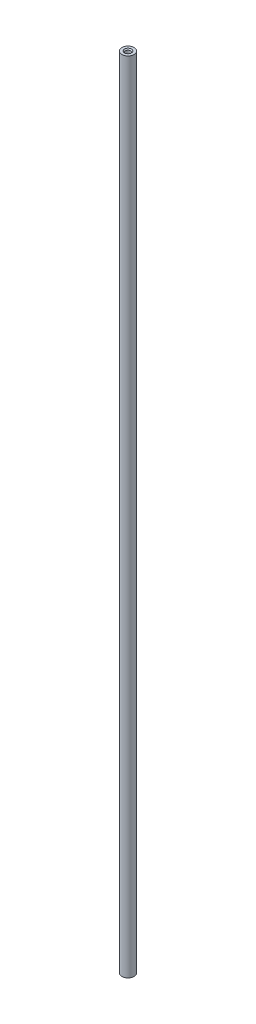
ISO-10303-21;
HEADER;
FILE_DESCRIPTION(('STEP AP214'),'2;1');
FILE_NAME('part.step','',(''),(''),'','','');
FILE_SCHEMA(('AUTOMOTIVE_DESIGN { 1 0 10303 214 1 1 1 1 }'));
ENDSEC;
DATA;
#1=APPLICATION_CONTEXT('core data for automotive mechanical design processes');
#2=APPLICATION_PROTOCOL_DEFINITION('international standard','automotive_design',2000,#1);
#3=PRODUCT_CONTEXT('',#1,'mechanical');
#4=PRODUCT('Part','Part','',(#3));
#5=PRODUCT_RELATED_PRODUCT_CATEGORY('part','',(#4));
#6=PRODUCT_DEFINITION_FORMATION('','',#4);
#7=PRODUCT_DEFINITION_CONTEXT('part definition',#1,'design');
#8=PRODUCT_DEFINITION('design','',#6,#7);
#9=PRODUCT_DEFINITION_SHAPE('','',#8);
#10=(LENGTH_UNIT() NAMED_UNIT(*) SI_UNIT(.MILLI.,.METRE.));
#11=(NAMED_UNIT(*) PLANE_ANGLE_UNIT() SI_UNIT($,.RADIAN.));
#12=(NAMED_UNIT(*) SI_UNIT($,.STERADIAN.) SOLID_ANGLE_UNIT());
#13=UNCERTAINTY_MEASURE_WITH_UNIT(LENGTH_MEASURE(1.E-05),#10,'distance_accuracy_value','');
#14=(GEOMETRIC_REPRESENTATION_CONTEXT(3) GLOBAL_UNCERTAINTY_ASSIGNED_CONTEXT((#13)) GLOBAL_UNIT_ASSIGNED_CONTEXT((#10,
#11,#12)) REPRESENTATION_CONTEXT('',''));
#15=CARTESIAN_POINT('',(0.,0.,0.));
#16=DIRECTION('',(0.,0.,1.));
#17=DIRECTION('',(1.,0.,0.));
#18=AXIS2_PLACEMENT_3D('',#15,#16,#17);
#19=CARTESIAN_POINT('',(0.,596.9,0.));
#20=DIRECTION('',(0.,1.,0.));
#21=DIRECTION('',(0.,0.,1.));
#22=AXIS2_PLACEMENT_3D('',#19,#20,#21);
#23=PLANE('',#22);
#24=CARTESIAN_POINT('',(0.,596.9,0.));
#25=DIRECTION('',(0.,1.,0.));
#26=DIRECTION('',(0.,0.,1.));
#27=AXIS2_PLACEMENT_3D('',#24,#25,#26);
#28=CIRCLE('',#27,1.905);
#29=CARTESIAN_POINT('',(0.,596.9,1.905));
#30=VERTEX_POINT('',#29);
#31=EDGE_CURVE('E17',#30,#30,#28,.T.);
#32=ORIENTED_EDGE('',*,*,#31,.T.);
#33=EDGE_LOOP('',(#32));
#34=FACE_BOUND('',#33,.T.);
#35=ADVANCED_FACE('F14',(#34),#23,.T.);
#36=CARTESIAN_POINT('',(0.,25.4,0.));
#37=DIRECTION('',(0.,-1.,0.));
#38=DIRECTION('',(0.,0.,-1.));
#39=AXIS2_PLACEMENT_3D('',#36,#37,#38);
#40=PLANE('',#39);
#41=CARTESIAN_POINT('',(0.,25.4,0.));
#42=DIRECTION('',(0.,-1.,0.));
#43=DIRECTION('',(0.,0.,-1.));
#44=AXIS2_PLACEMENT_3D('',#41,#42,#43);
#45=CIRCLE('',#44,1.905);
#46=CARTESIAN_POINT('',(0.,25.4,-1.905));
#47=VERTEX_POINT('',#46);
#48=EDGE_CURVE('E37',#47,#47,#45,.T.);
#49=ORIENTED_EDGE('',*,*,#48,.T.);
#50=EDGE_LOOP('',(#49));
#51=FACE_BOUND('',#50,.T.);
#52=ADVANCED_FACE('F50',(#51),#40,.T.);
#53=CARTESIAN_POINT('',(0.,622.3,0.));
#54=DIRECTION('',(0.,1.,0.));
#55=DIRECTION('',(0.,0.,1.));
#56=AXIS2_PLACEMENT_3D('',#53,#54,#55);
#57=CYLINDRICAL_SURFACE('',#56,1.905);
#58=ORIENTED_EDGE('',*,*,#31,.F.);
#59=EDGE_LOOP('',(#58));
#60=FACE_BOUND('',#59,.T.);
#61=CARTESIAN_POINT('',(0.,621.537999999678,0.));
#62=DIRECTION('',(0.,1.,0.));
#63=DIRECTION('',(0.,0.,-1.));
#64=AXIS2_PLACEMENT_3D('',#61,#62,#63);
#65=CIRCLE('',#64,1.90499999967795);
#66=CARTESIAN_POINT('',(0.,621.537999999678,-1.90499999967795));
#67=VERTEX_POINT('',#66);
#68=EDGE_CURVE('E29',#67,#67,#65,.T.);
#69=ORIENTED_EDGE('',*,*,#68,.T.);
#70=EDGE_LOOP('',(#69));
#71=FACE_BOUND('',#70,.T.);
#72=ADVANCED_FACE('F46',(#60,#71),#57,.F.);
#73=CARTESIAN_POINT('',(0.,0.,0.));
#74=DIRECTION('',(0.,-1.,0.));
#75=DIRECTION('',(0.,0.,-1.));
#76=AXIS2_PLACEMENT_3D('',#73,#74,#75);
#77=CYLINDRICAL_SURFACE('',#76,1.905);
#78=ORIENTED_EDGE('',*,*,#48,.F.);
#79=EDGE_LOOP('',(#78));
#80=FACE_BOUND('',#79,.T.);
#81=CARTESIAN_POINT('',(0.,0.762000000322036,0.));
#82=DIRECTION('',(0.,-1.,0.));
#83=DIRECTION('',(0.,0.,-1.));
#84=AXIS2_PLACEMENT_3D('',#81,#82,#83);
#85=CIRCLE('',#84,1.90499999967796);
#86=CARTESIAN_POINT('',(0.,0.762000000322036,-1.90499999967796));
#87=VERTEX_POINT('',#86);
#88=EDGE_CURVE('E36',#87,#87,#85,.T.);
#89=ORIENTED_EDGE('',*,*,#88,.T.);
#90=EDGE_LOOP('',(#89));
#91=FACE_BOUND('',#90,.T.);
#92=ADVANCED_FACE('F49',(#80,#91),#77,.F.);
#93=CARTESIAN_POINT('',(0.,622.299999997318,0.));
#94=DIRECTION('',(0.,1.,0.));
#95=DIRECTION('',(0.,0.,1.));
#96=AXIS2_PLACEMENT_3D('',#93,#94,#95);
#97=CONICAL_SURFACE('',#96,2.66699999731789,0.785398163397482);
#98=ORIENTED_EDGE('',*,*,#68,.F.);
#99=EDGE_LOOP('',(#98));
#100=FACE_BOUND('',#99,.T.);
#101=CARTESIAN_POINT('',(0.,622.299999997318,0.));
#102=DIRECTION('',(0.,1.,0.));
#103=DIRECTION('',(0.,0.,1.));
#104=AXIS2_PLACEMENT_3D('',#101,#102,#103);
#105=CIRCLE('',#104,2.6669999973179);
#106=CARTESIAN_POINT('',(0.,622.299999997318,2.6669999973179));
#107=VERTEX_POINT('',#106);
#108=EDGE_CURVE('E34',#107,#107,#105,.F.);
#109=ORIENTED_EDGE('',*,*,#108,.F.);
#110=EDGE_LOOP('',(#109));
#111=FACE_BOUND('',#110,.T.);
#112=ADVANCED_FACE('F54',(#100,#111),#97,.F.);
#113=CARTESIAN_POINT('',(0.,2.68214617182849E-09,0.));
#114=DIRECTION('',(0.,-1.,0.));
#115=DIRECTION('',(0.,0.,-1.));
#116=AXIS2_PLACEMENT_3D('',#113,#114,#115);
#117=CONICAL_SURFACE('',#116,2.66699999731785,0.785398163397448);
#118=ORIENTED_EDGE('',*,*,#88,.F.);
#119=EDGE_LOOP('',(#118));
#120=FACE_BOUND('',#119,.T.);
#121=CARTESIAN_POINT('',(0.,2.68214270238154E-09,0.));
#122=DIRECTION('',(0.,-1.,0.));
#123=DIRECTION('',(0.,0.,-1.));
#124=AXIS2_PLACEMENT_3D('',#121,#122,#123);
#125=CIRCLE('',#124,2.66699999731786);
#126=CARTESIAN_POINT('',(0.,2.68214270238154E-09,-2.66699999731786));
#127=VERTEX_POINT('',#126);
#128=EDGE_CURVE('E26',#127,#127,#125,.T.);
#129=ORIENTED_EDGE('',*,*,#128,.T.);
#130=EDGE_LOOP('',(#129));
#131=FACE_BOUND('',#130,.T.);
#132=ADVANCED_FACE('F57',(#120,#131),#117,.F.);
#133=CARTESIAN_POINT('',(0.,622.3,0.));
#134=DIRECTION('',(0.,1.,0.));
#135=DIRECTION('',(0.,0.,1.));
#136=AXIS2_PLACEMENT_3D('',#133,#134,#135);
#137=PLANE('',#136);
#138=ORIENTED_EDGE('',*,*,#108,.T.);
#139=EDGE_LOOP('',(#138));
#140=FACE_BOUND('',#139,.T.);
#141=CARTESIAN_POINT('',(0.,622.3,0.));
#142=DIRECTION('',(0.,1.,0.));
#143=DIRECTION('',(0.,0.,1.));
#144=AXIS2_PLACEMENT_3D('',#141,#142,#143);
#145=CIRCLE('',#144,4.7625);
#146=CARTESIAN_POINT('',(0.,622.3,4.7625));
#147=VERTEX_POINT('',#146);
#148=EDGE_CURVE('E21',#147,#147,#145,.F.);
#149=ORIENTED_EDGE('',*,*,#148,.F.);
#150=EDGE_LOOP('',(#149));
#151=FACE_BOUND('',#150,.T.);
#152=ADVANCED_FACE('F61',(#140,#151),#137,.T.);
#153=CARTESIAN_POINT('',(0.,0.,0.));
#154=DIRECTION('',(0.,1.,0.));
#155=DIRECTION('',(0.,0.,1.));
#156=AXIS2_PLACEMENT_3D('',#153,#154,#155);
#157=PLANE('',#156);
#158=ORIENTED_EDGE('',*,*,#128,.F.);
#159=EDGE_LOOP('',(#158));
#160=FACE_BOUND('',#159,.T.);
#161=CARTESIAN_POINT('',(0.,0.,0.));
#162=DIRECTION('',(0.,1.,0.));
#163=DIRECTION('',(0.,0.,1.));
#164=AXIS2_PLACEMENT_3D('',#161,#162,#163);
#165=CIRCLE('',#164,4.7625);
#166=CARTESIAN_POINT('',(0.,0.,4.7625));
#167=VERTEX_POINT('',#166);
#168=EDGE_CURVE('E10',#167,#167,#165,.T.);
#169=ORIENTED_EDGE('',*,*,#168,.F.);
#170=EDGE_LOOP('',(#169));
#171=FACE_BOUND('',#170,.T.);
#172=ADVANCED_FACE('F64',(#160,#171),#157,.F.);
#173=CARTESIAN_POINT('',(0.,0.,0.));
#174=DIRECTION('',(0.,1.,0.));
#175=DIRECTION('',(0.,0.,1.));
#176=AXIS2_PLACEMENT_3D('',#173,#174,#175);
#177=CYLINDRICAL_SURFACE('',#176,4.7625);
#178=ORIENTED_EDGE('',*,*,#148,.T.);
#179=EDGE_LOOP('',(#178));
#180=FACE_BOUND('',#179,.T.);
#181=ORIENTED_EDGE('',*,*,#168,.T.);
#182=EDGE_LOOP('',(#181));
#183=FACE_BOUND('',#182,.T.);
#184=ADVANCED_FACE('F68',(#180,#183),#177,.T.);
#185=CLOSED_SHELL('',(#35,#52,#72,#92,#112,#132,#152,#172,#184));
#186=MANIFOLD_SOLID_BREP('B1',#185);
#187=ADVANCED_BREP_SHAPE_REPRESENTATION('',(#18,#186),#14);
#188=SHAPE_DEFINITION_REPRESENTATION(#9,#187);
ENDSEC;
END-ISO-10303-21;
